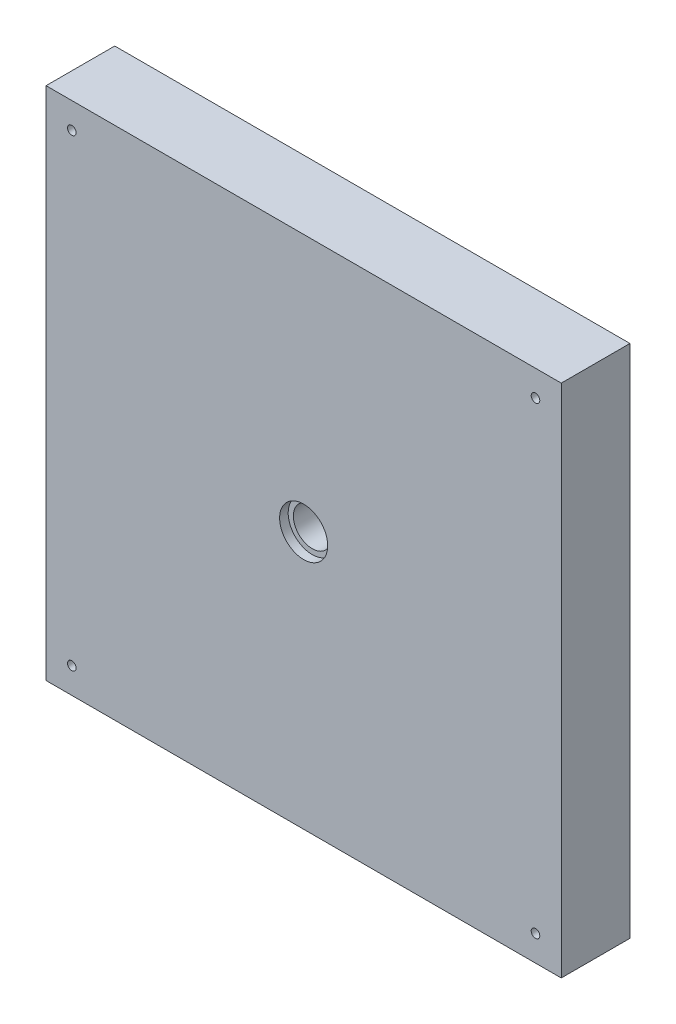
ISO-10303-21;
HEADER;
FILE_DESCRIPTION(('STEP AP214'),'2;1');
FILE_NAME('part.step','',(''),(''),'','','');
FILE_SCHEMA(('AUTOMOTIVE_DESIGN { 1 0 10303 214 1 1 1 1 }'));
ENDSEC;
DATA;
#1=APPLICATION_CONTEXT('core data for automotive mechanical design processes');
#2=APPLICATION_PROTOCOL_DEFINITION('international standard','automotive_design',2000,#1);
#3=PRODUCT_CONTEXT('',#1,'mechanical');
#4=PRODUCT('Part','Part','',(#3));
#5=PRODUCT_RELATED_PRODUCT_CATEGORY('part','',(#4));
#6=PRODUCT_DEFINITION_FORMATION('','',#4);
#7=PRODUCT_DEFINITION_CONTEXT('part definition',#1,'design');
#8=PRODUCT_DEFINITION('design','',#6,#7);
#9=PRODUCT_DEFINITION_SHAPE('','',#8);
#10=(LENGTH_UNIT() NAMED_UNIT(*) SI_UNIT(.MILLI.,.METRE.));
#11=(NAMED_UNIT(*) PLANE_ANGLE_UNIT() SI_UNIT($,.RADIAN.));
#12=(NAMED_UNIT(*) SI_UNIT($,.STERADIAN.) SOLID_ANGLE_UNIT());
#13=UNCERTAINTY_MEASURE_WITH_UNIT(LENGTH_MEASURE(1.E-05),#10,'distance_accuracy_value','');
#14=(GEOMETRIC_REPRESENTATION_CONTEXT(3) GLOBAL_UNCERTAINTY_ASSIGNED_CONTEXT((#13)) GLOBAL_UNIT_ASSIGNED_CONTEXT((#10,
#11,#12)) REPRESENTATION_CONTEXT('',''));
#15=CARTESIAN_POINT('',(0.,0.,0.));
#16=DIRECTION('',(0.,0.,1.));
#17=DIRECTION('',(1.,0.,0.));
#18=AXIS2_PLACEMENT_3D('',#15,#16,#17);
#19=CARTESIAN_POINT('',(150.,-150.,0.));
#20=DIRECTION('',(0.,0.,1.));
#21=DIRECTION('',(1.,0.,0.));
#22=AXIS2_PLACEMENT_3D('',#19,#20,#21);
#23=CYLINDRICAL_SURFACE('',#22,11.);
#24=CARTESIAN_POINT('',(150.,-150.,0.));
#25=DIRECTION('',(0.,0.,1.));
#26=DIRECTION('',(1.,0.,0.));
#27=AXIS2_PLACEMENT_3D('',#24,#25,#26);
#28=CIRCLE('',#27,11.);
#29=CARTESIAN_POINT('',(161.,-150.,0.));
#30=VERTEX_POINT('',#29);
#31=EDGE_CURVE('E140',#30,#30,#28,.T.);
#32=ORIENTED_EDGE('',*,*,#31,.F.);
#33=EDGE_LOOP('',(#32));
#34=FACE_BOUND('',#33,.T.);
#35=CARTESIAN_POINT('',(150.,-150.,35.));
#36=DIRECTION('',(0.,0.,1.));
#37=DIRECTION('',(1.,0.,0.));
#38=AXIS2_PLACEMENT_3D('',#35,#36,#37);
#39=CIRCLE('',#38,11.);
#40=CARTESIAN_POINT('',(161.,-150.,35.));
#41=VERTEX_POINT('',#40);
#42=EDGE_CURVE('E119',#41,#41,#39,.F.);
#43=ORIENTED_EDGE('',*,*,#42,.F.);
#44=EDGE_LOOP('',(#43));
#45=FACE_BOUND('',#44,.T.);
#46=ADVANCED_FACE('F44',(#34,#45),#23,.F.);
#47=CARTESIAN_POINT('',(0.,0.,40.));
#48=DIRECTION('',(1.,0.,0.));
#49=DIRECTION('',(0.,1.,0.));
#50=AXIS2_PLACEMENT_3D('',#47,#48,#49);
#51=PLANE('',#50);
#52=DIRECTION('',(0.,-1.,0.));
#53=VECTOR('',#52,1.);
#54=CARTESIAN_POINT('',(0.,0.,0.));
#55=LINE('',#54,#53);
#56=CARTESIAN_POINT('',(0.,0.,0.));
#57=VERTEX_POINT('',#56);
#58=CARTESIAN_POINT('',(0.,-300.,0.));
#59=VERTEX_POINT('',#58);
#60=EDGE_CURVE('E144',#57,#59,#55,.T.);
#61=ORIENTED_EDGE('',*,*,#60,.T.);
#62=DIRECTION('',(0.,0.,-1.));
#63=VECTOR('',#62,1.);
#64=CARTESIAN_POINT('',(0.,-300.,40.));
#65=LINE('',#64,#63);
#66=CARTESIAN_POINT('',(0.,-300.,40.));
#67=VERTEX_POINT('',#66);
#68=EDGE_CURVE('E174',#67,#59,#65,.T.);
#69=ORIENTED_EDGE('',*,*,#68,.F.);
#70=DIRECTION('',(0.,-1.,0.));
#71=VECTOR('',#70,1.);
#72=CARTESIAN_POINT('',(0.,0.,40.));
#73=LINE('',#72,#71);
#74=CARTESIAN_POINT('',(0.,0.,40.));
#75=VERTEX_POINT('',#74);
#76=EDGE_CURVE('E145',#75,#67,#73,.T.);
#77=ORIENTED_EDGE('',*,*,#76,.F.);
#78=DIRECTION('',(0.,0.,-1.));
#79=VECTOR('',#78,1.);
#80=CARTESIAN_POINT('',(0.,0.,40.));
#81=LINE('',#80,#79);
#82=EDGE_CURVE('E155',#75,#57,#81,.T.);
#83=ORIENTED_EDGE('',*,*,#82,.T.);
#84=EDGE_LOOP('',(#61,#69,#77,#83));
#85=FACE_BOUND('',#84,.T.);
#86=ADVANCED_FACE('F221',(#85),#51,.F.);
#87=CARTESIAN_POINT('',(0.,-300.,40.));
#88=DIRECTION('',(0.,1.,0.));
#89=DIRECTION('',(0.,0.,1.));
#90=AXIS2_PLACEMENT_3D('',#87,#88,#89);
#91=PLANE('',#90);
#92=DIRECTION('',(1.,0.,0.));
#93=VECTOR('',#92,1.);
#94=CARTESIAN_POINT('',(0.,-300.,0.));
#95=LINE('',#94,#93);
#96=CARTESIAN_POINT('',(300.,-300.,0.));
#97=VERTEX_POINT('',#96);
#98=EDGE_CURVE('E159',#59,#97,#95,.T.);
#99=ORIENTED_EDGE('',*,*,#98,.T.);
#100=DIRECTION('',(0.,0.,-1.));
#101=VECTOR('',#100,1.);
#102=CARTESIAN_POINT('',(300.,-300.,40.));
#103=LINE('',#102,#101);
#104=CARTESIAN_POINT('',(300.,-300.,40.));
#105=VERTEX_POINT('',#104);
#106=EDGE_CURVE('E171',#105,#97,#103,.T.);
#107=ORIENTED_EDGE('',*,*,#106,.F.);
#108=DIRECTION('',(1.,0.,0.));
#109=VECTOR('',#108,1.);
#110=CARTESIAN_POINT('',(0.,-300.,40.));
#111=LINE('',#110,#109);
#112=EDGE_CURVE('E94',#67,#105,#111,.T.);
#113=ORIENTED_EDGE('',*,*,#112,.F.);
#114=ORIENTED_EDGE('',*,*,#68,.T.);
#115=EDGE_LOOP('',(#99,#107,#113,#114));
#116=FACE_BOUND('',#115,.T.);
#117=ADVANCED_FACE('F227',(#116),#91,.F.);
#118=CARTESIAN_POINT('',(300.,0.,40.));
#119=DIRECTION('',(-1.,0.,0.));
#120=DIRECTION('',(0.,-1.,0.));
#121=AXIS2_PLACEMENT_3D('',#118,#119,#120);
#122=PLANE('',#121);
#123=DIRECTION('',(0.,1.,0.));
#124=VECTOR('',#123,1.);
#125=CARTESIAN_POINT('',(300.,0.,0.));
#126=LINE('',#125,#124);
#127=CARTESIAN_POINT('',(300.,0.,0.));
#128=VERTEX_POINT('',#127);
#129=EDGE_CURVE('E80',#97,#128,#126,.T.);
#130=ORIENTED_EDGE('',*,*,#129,.T.);
#131=DIRECTION('',(0.,0.,-1.));
#132=VECTOR('',#131,1.);
#133=CARTESIAN_POINT('',(300.,0.,40.));
#134=LINE('',#133,#132);
#135=CARTESIAN_POINT('',(300.,0.,40.));
#136=VERTEX_POINT('',#135);
#137=EDGE_CURVE('E168',#136,#128,#134,.T.);
#138=ORIENTED_EDGE('',*,*,#137,.F.);
#139=DIRECTION('',(0.,1.,0.));
#140=VECTOR('',#139,1.);
#141=CARTESIAN_POINT('',(300.,0.,40.));
#142=LINE('',#141,#140);
#143=EDGE_CURVE('E150',#105,#136,#142,.T.);
#144=ORIENTED_EDGE('',*,*,#143,.F.);
#145=ORIENTED_EDGE('',*,*,#106,.T.);
#146=EDGE_LOOP('',(#130,#138,#144,#145));
#147=FACE_BOUND('',#146,.T.);
#148=ADVANCED_FACE('F247',(#147),#122,.F.);
#149=CARTESIAN_POINT('',(0.,0.,40.));
#150=DIRECTION('',(0.,-1.,0.));
#151=DIRECTION('',(0.,0.,-1.));
#152=AXIS2_PLACEMENT_3D('',#149,#150,#151);
#153=PLANE('',#152);
#154=DIRECTION('',(-1.,0.,0.));
#155=VECTOR('',#154,1.);
#156=CARTESIAN_POINT('',(0.,0.,0.));
#157=LINE('',#156,#155);
#158=EDGE_CURVE('E86',#128,#57,#157,.T.);
#159=ORIENTED_EDGE('',*,*,#158,.T.);
#160=ORIENTED_EDGE('',*,*,#82,.F.);
#161=DIRECTION('',(-1.,0.,0.));
#162=VECTOR('',#161,1.);
#163=CARTESIAN_POINT('',(0.,0.,40.));
#164=LINE('',#163,#162);
#165=EDGE_CURVE('E62',#136,#75,#164,.T.);
#166=ORIENTED_EDGE('',*,*,#165,.F.);
#167=ORIENTED_EDGE('',*,*,#137,.T.);
#168=EDGE_LOOP('',(#159,#160,#166,#167));
#169=FACE_BOUND('',#168,.T.);
#170=ADVANCED_FACE('F240',(#169),#153,.F.);
#171=CARTESIAN_POINT('',(0.,0.,40.));
#172=DIRECTION('',(0.,0.,1.));
#173=DIRECTION('',(1.,0.,0.));
#174=AXIS2_PLACEMENT_3D('',#171,#172,#173);
#175=PLANE('',#174);
#176=CARTESIAN_POINT('',(285.,-15.,40.));
#177=DIRECTION('',(0.,0.,-1.));
#178=DIRECTION('',(-1.,0.,0.));
#179=AXIS2_PLACEMENT_3D('',#176,#177,#178);
#180=CIRCLE('',#179,2.5);
#181=CARTESIAN_POINT('',(282.5,-15.,40.));
#182=VERTEX_POINT('',#181);
#183=EDGE_CURVE('E312',#182,#182,#180,.T.);
#184=ORIENTED_EDGE('',*,*,#183,.T.);
#185=EDGE_LOOP('',(#184));
#186=FACE_BOUND('',#185,.T.);
#187=CARTESIAN_POINT('',(15.,-15.,40.));
#188=DIRECTION('',(0.,0.,-1.));
#189=DIRECTION('',(-1.,0.,0.));
#190=AXIS2_PLACEMENT_3D('',#187,#188,#189);
#191=CIRCLE('',#190,2.5);
#192=CARTESIAN_POINT('',(12.5,-15.,40.));
#193=VERTEX_POINT('',#192);
#194=EDGE_CURVE('E325',#193,#193,#191,.T.);
#195=ORIENTED_EDGE('',*,*,#194,.T.);
#196=EDGE_LOOP('',(#195));
#197=FACE_BOUND('',#196,.T.);
#198=CARTESIAN_POINT('',(15.,-285.,40.));
#199=DIRECTION('',(0.,0.,-1.));
#200=DIRECTION('',(-1.,0.,0.));
#201=AXIS2_PLACEMENT_3D('',#198,#199,#200);
#202=CIRCLE('',#201,2.5);
#203=CARTESIAN_POINT('',(12.5,-285.,40.));
#204=VERTEX_POINT('',#203);
#205=EDGE_CURVE('E333',#204,#204,#202,.T.);
#206=ORIENTED_EDGE('',*,*,#205,.T.);
#207=EDGE_LOOP('',(#206));
#208=FACE_BOUND('',#207,.T.);
#209=CARTESIAN_POINT('',(285.,-285.,40.));
#210=DIRECTION('',(0.,0.,-1.));
#211=DIRECTION('',(-1.,0.,0.));
#212=AXIS2_PLACEMENT_3D('',#209,#210,#211);
#213=CIRCLE('',#212,2.5);
#214=CARTESIAN_POINT('',(282.5,-285.,40.));
#215=VERTEX_POINT('',#214);
#216=EDGE_CURVE('E341',#215,#215,#213,.T.);
#217=ORIENTED_EDGE('',*,*,#216,.T.);
#218=EDGE_LOOP('',(#217));
#219=FACE_BOUND('',#218,.T.);
#220=CARTESIAN_POINT('',(150.,-150.,40.));
#221=DIRECTION('',(0.,0.,1.));
#222=DIRECTION('',(1.,0.,0.));
#223=AXIS2_PLACEMENT_3D('',#220,#221,#222);
#224=CIRCLE('',#223,14.);
#225=CARTESIAN_POINT('',(164.,-150.,40.));
#226=VERTEX_POINT('',#225);
#227=EDGE_CURVE('E130',#226,#226,#224,.T.);
#228=ORIENTED_EDGE('',*,*,#227,.F.);
#229=EDGE_LOOP('',(#228));
#230=FACE_BOUND('',#229,.T.);
#231=ORIENTED_EDGE('',*,*,#76,.T.);
#232=ORIENTED_EDGE('',*,*,#112,.T.);
#233=ORIENTED_EDGE('',*,*,#143,.T.);
#234=ORIENTED_EDGE('',*,*,#165,.T.);
#235=EDGE_LOOP('',(#231,#232,#233,#234));
#236=FACE_BOUND('',#235,.T.);
#237=ADVANCED_FACE('F236',(#186,#197,#208,#219,#230,#236),#175,.T.);
#238=CARTESIAN_POINT('',(0.,0.,0.));
#239=DIRECTION('',(0.,0.,1.));
#240=DIRECTION('',(1.,0.,0.));
#241=AXIS2_PLACEMENT_3D('',#238,#239,#240);
#242=PLANE('',#241);
#243=CARTESIAN_POINT('',(285.,-15.,0.));
#244=DIRECTION('',(0.,0.,-1.));
#245=DIRECTION('',(-1.,0.,0.));
#246=AXIS2_PLACEMENT_3D('',#243,#244,#245);
#247=CIRCLE('',#246,2.5);
#248=CARTESIAN_POINT('',(282.5,-15.,0.));
#249=VERTEX_POINT('',#248);
#250=EDGE_CURVE('E315',#249,#249,#247,.T.);
#251=ORIENTED_EDGE('',*,*,#250,.F.);
#252=EDGE_LOOP('',(#251));
#253=FACE_BOUND('',#252,.T.);
#254=CARTESIAN_POINT('',(15.,-15.,0.));
#255=DIRECTION('',(0.,0.,-1.));
#256=DIRECTION('',(-1.,0.,0.));
#257=AXIS2_PLACEMENT_3D('',#254,#255,#256);
#258=CIRCLE('',#257,2.49999999999999);
#259=CARTESIAN_POINT('',(12.5,-15.,0.));
#260=VERTEX_POINT('',#259);
#261=EDGE_CURVE('E319',#260,#260,#258,.T.);
#262=ORIENTED_EDGE('',*,*,#261,.F.);
#263=EDGE_LOOP('',(#262));
#264=FACE_BOUND('',#263,.T.);
#265=CARTESIAN_POINT('',(15.,-285.,0.));
#266=DIRECTION('',(0.,0.,-1.));
#267=DIRECTION('',(-1.,0.,0.));
#268=AXIS2_PLACEMENT_3D('',#265,#266,#267);
#269=CIRCLE('',#268,2.49999999999999);
#270=CARTESIAN_POINT('',(12.5,-285.,0.));
#271=VERTEX_POINT('',#270);
#272=EDGE_CURVE('E329',#271,#271,#269,.T.);
#273=ORIENTED_EDGE('',*,*,#272,.F.);
#274=EDGE_LOOP('',(#273));
#275=FACE_BOUND('',#274,.T.);
#276=CARTESIAN_POINT('',(285.,-285.,0.));
#277=DIRECTION('',(0.,0.,-1.));
#278=DIRECTION('',(-1.,0.,0.));
#279=AXIS2_PLACEMENT_3D('',#276,#277,#278);
#280=CIRCLE('',#279,2.5);
#281=CARTESIAN_POINT('',(282.5,-285.,0.));
#282=VERTEX_POINT('',#281);
#283=EDGE_CURVE('E337',#282,#282,#280,.T.);
#284=ORIENTED_EDGE('',*,*,#283,.F.);
#285=EDGE_LOOP('',(#284));
#286=FACE_BOUND('',#285,.T.);
#287=CARTESIAN_POINT('',(40.,-150.,0.));
#288=DIRECTION('',(0.,0.,1.));
#289=DIRECTION('',(1.,0.,0.));
#290=AXIS2_PLACEMENT_3D('',#287,#288,#289);
#291=CIRCLE('',#290,3.49999999999989);
#292=CARTESIAN_POINT('',(43.4999999999999,-150.,0.));
#293=VERTEX_POINT('',#292);
#294=EDGE_CURVE('E11',#293,#293,#291,.T.);
#295=ORIENTED_EDGE('',*,*,#294,.T.);
#296=EDGE_LOOP('',(#295));
#297=FACE_BOUND('',#296,.T.);
#298=CARTESIAN_POINT('',(150.,-260.,0.));
#299=DIRECTION('',(0.,0.,1.));
#300=DIRECTION('',(1.,0.,0.));
#301=AXIS2_PLACEMENT_3D('',#298,#299,#300);
#302=CIRCLE('',#301,3.49999999999989);
#303=CARTESIAN_POINT('',(153.5,-260.,0.));
#304=VERTEX_POINT('',#303);
#305=EDGE_CURVE('E197',#304,#304,#302,.T.);
#306=ORIENTED_EDGE('',*,*,#305,.T.);
#307=EDGE_LOOP('',(#306));
#308=FACE_BOUND('',#307,.T.);
#309=CARTESIAN_POINT('',(150.,-40.,0.));
#310=DIRECTION('',(0.,0.,1.));
#311=DIRECTION('',(1.,0.,0.));
#312=AXIS2_PLACEMENT_3D('',#309,#310,#311);
#313=CIRCLE('',#312,3.49999999999989);
#314=CARTESIAN_POINT('',(153.5,-40.,0.));
#315=VERTEX_POINT('',#314);
#316=EDGE_CURVE('E189',#315,#315,#313,.T.);
#317=ORIENTED_EDGE('',*,*,#316,.T.);
#318=EDGE_LOOP('',(#317));
#319=FACE_BOUND('',#318,.T.);
#320=CARTESIAN_POINT('',(260.,-150.,0.));
#321=DIRECTION('',(0.,0.,1.));
#322=DIRECTION('',(1.,0.,0.));
#323=AXIS2_PLACEMENT_3D('',#320,#321,#322);
#324=CIRCLE('',#323,3.49999999999989);
#325=CARTESIAN_POINT('',(263.5,-150.,0.));
#326=VERTEX_POINT('',#325);
#327=EDGE_CURVE('E181',#326,#326,#324,.T.);
#328=ORIENTED_EDGE('',*,*,#327,.T.);
#329=EDGE_LOOP('',(#328));
#330=FACE_BOUND('',#329,.T.);
#331=ORIENTED_EDGE('',*,*,#31,.T.);
#332=EDGE_LOOP('',(#331));
#333=FACE_BOUND('',#332,.T.);
#334=ORIENTED_EDGE('',*,*,#60,.F.);
#335=ORIENTED_EDGE('',*,*,#158,.F.);
#336=ORIENTED_EDGE('',*,*,#129,.F.);
#337=ORIENTED_EDGE('',*,*,#98,.F.);
#338=EDGE_LOOP('',(#334,#335,#336,#337));
#339=FACE_BOUND('',#338,.T.);
#340=ADVANCED_FACE('F239',(#253,#264,#275,#286,#297,#308,#319,#330,#333,#339),#242,.F.);
#341=CARTESIAN_POINT('',(260.,-150.,17.));
#342=DIRECTION('',(0.,0.,-1.));
#343=DIRECTION('',(-1.,0.,0.));
#344=AXIS2_PLACEMENT_3D('',#341,#342,#343);
#345=CONICAL_SURFACE('',#344,2.5,1.02974425867666);
#346=CARTESIAN_POINT('',(260.,-150.,18.5021515475689));
#347=VERTEX_POINT('',#346);
#348=VERTEX_LOOP('',#347);
#349=FACE_BOUND('',#348,.T.);
#350=CARTESIAN_POINT('',(260.,-150.,17.));
#351=DIRECTION('',(0.,0.,-1.));
#352=DIRECTION('',(-1.,0.,0.));
#353=AXIS2_PLACEMENT_3D('',#350,#351,#352);
#354=CIRCLE('',#353,2.5);
#355=CARTESIAN_POINT('',(257.5,-150.,17.));
#356=VERTEX_POINT('',#355);
#357=EDGE_CURVE('E136',#356,#356,#354,.T.);
#358=ORIENTED_EDGE('',*,*,#357,.T.);
#359=EDGE_LOOP('',(#358));
#360=FACE_BOUND('',#359,.T.);
#361=ADVANCED_FACE('F234',(#349,#360),#345,.F.);
#362=CARTESIAN_POINT('',(260.,-150.,0.));
#363=DIRECTION('',(0.,0.,-1.));
#364=DIRECTION('',(-1.,0.,0.));
#365=AXIS2_PLACEMENT_3D('',#362,#363,#364);
#366=CYLINDRICAL_SURFACE('',#365,2.5);
#367=CARTESIAN_POINT('',(260.,-150.,0.999999999999899));
#368=DIRECTION('',(0.,0.,1.));
#369=DIRECTION('',(1.,0.,0.));
#370=AXIS2_PLACEMENT_3D('',#367,#368,#369);
#371=CIRCLE('',#370,2.5);
#372=CARTESIAN_POINT('',(262.5,-150.,0.999999999999899));
#373=VERTEX_POINT('',#372);
#374=EDGE_CURVE('E176',#373,#373,#371,.F.);
#375=ORIENTED_EDGE('',*,*,#374,.T.);
#376=EDGE_LOOP('',(#375));
#377=FACE_BOUND('',#376,.T.);
#378=ORIENTED_EDGE('',*,*,#357,.F.);
#379=EDGE_LOOP('',(#378));
#380=FACE_BOUND('',#379,.T.);
#381=ADVANCED_FACE('F274',(#377,#380),#366,.F.);
#382=CARTESIAN_POINT('',(150.,-40.,17.));
#383=DIRECTION('',(0.,0.,-1.));
#384=DIRECTION('',(-1.,0.,0.));
#385=AXIS2_PLACEMENT_3D('',#382,#383,#384);
#386=CONICAL_SURFACE('',#385,2.5,1.02974425867665);
#387=CARTESIAN_POINT('',(150.,-40.,18.5021515475689));
#388=VERTEX_POINT('',#387);
#389=VERTEX_LOOP('',#388);
#390=FACE_BOUND('',#389,.T.);
#391=CARTESIAN_POINT('',(150.,-40.,17.));
#392=DIRECTION('',(0.,0.,-1.));
#393=DIRECTION('',(-1.,0.,0.));
#394=AXIS2_PLACEMENT_3D('',#391,#392,#393);
#395=CIRCLE('',#394,2.5);
#396=CARTESIAN_POINT('',(147.5,-40.,17.));
#397=VERTEX_POINT('',#396);
#398=EDGE_CURVE('E124',#397,#397,#395,.T.);
#399=ORIENTED_EDGE('',*,*,#398,.T.);
#400=EDGE_LOOP('',(#399));
#401=FACE_BOUND('',#400,.T.);
#402=ADVANCED_FACE('F269',(#390,#401),#386,.F.);
#403=CARTESIAN_POINT('',(150.,-40.,0.));
#404=DIRECTION('',(0.,0.,-1.));
#405=DIRECTION('',(-1.,0.,0.));
#406=AXIS2_PLACEMENT_3D('',#403,#404,#405);
#407=CYLINDRICAL_SURFACE('',#406,2.5);
#408=CARTESIAN_POINT('',(150.,-40.,0.999999999999899));
#409=DIRECTION('',(0.,0.,1.));
#410=DIRECTION('',(1.,0.,0.));
#411=AXIS2_PLACEMENT_3D('',#408,#409,#410);
#412=CIRCLE('',#411,2.5);
#413=CARTESIAN_POINT('',(152.5,-40.,0.999999999999899));
#414=VERTEX_POINT('',#413);
#415=EDGE_CURVE('E185',#414,#414,#412,.F.);
#416=ORIENTED_EDGE('',*,*,#415,.T.);
#417=EDGE_LOOP('',(#416));
#418=FACE_BOUND('',#417,.T.);
#419=ORIENTED_EDGE('',*,*,#398,.F.);
#420=EDGE_LOOP('',(#419));
#421=FACE_BOUND('',#420,.T.);
#422=ADVANCED_FACE('F265',(#418,#421),#407,.F.);
#423=CARTESIAN_POINT('',(40.,-150.,17.));
#424=DIRECTION('',(0.,0.,-1.));
#425=DIRECTION('',(-1.,0.,0.));
#426=AXIS2_PLACEMENT_3D('',#423,#424,#425);
#427=CONICAL_SURFACE('',#426,2.5,1.02974425867665);
#428=CARTESIAN_POINT('',(40.,-150.,18.5021515475689));
#429=VERTEX_POINT('',#428);
#430=VERTEX_LOOP('',#429);
#431=FACE_BOUND('',#430,.T.);
#432=CARTESIAN_POINT('',(40.,-150.,17.));
#433=DIRECTION('',(0.,0.,-1.));
#434=DIRECTION('',(-1.,0.,0.));
#435=AXIS2_PLACEMENT_3D('',#432,#433,#434);
#436=CIRCLE('',#435,2.5);
#437=CARTESIAN_POINT('',(37.5,-150.,17.));
#438=VERTEX_POINT('',#437);
#439=EDGE_CURVE('E118',#438,#438,#436,.T.);
#440=ORIENTED_EDGE('',*,*,#439,.T.);
#441=EDGE_LOOP('',(#440));
#442=FACE_BOUND('',#441,.T.);
#443=ADVANCED_FACE('F268',(#431,#442),#427,.F.);
#444=CARTESIAN_POINT('',(40.,-150.,0.));
#445=DIRECTION('',(0.,0.,-1.));
#446=DIRECTION('',(-1.,0.,0.));
#447=AXIS2_PLACEMENT_3D('',#444,#445,#446);
#448=CYLINDRICAL_SURFACE('',#447,2.5);
#449=CARTESIAN_POINT('',(40.,-150.,0.999999999999902));
#450=DIRECTION('',(0.,0.,1.));
#451=DIRECTION('',(1.,0.,0.));
#452=AXIS2_PLACEMENT_3D('',#449,#450,#451);
#453=CIRCLE('',#452,2.5);
#454=CARTESIAN_POINT('',(42.5,-150.,0.999999999999902));
#455=VERTEX_POINT('',#454);
#456=EDGE_CURVE('E54',#455,#455,#453,.F.);
#457=ORIENTED_EDGE('',*,*,#456,.T.);
#458=EDGE_LOOP('',(#457));
#459=FACE_BOUND('',#458,.T.);
#460=ORIENTED_EDGE('',*,*,#439,.F.);
#461=EDGE_LOOP('',(#460));
#462=FACE_BOUND('',#461,.T.);
#463=ADVANCED_FACE('F111',(#459,#462),#448,.F.);
#464=CARTESIAN_POINT('',(150.,-260.,17.));
#465=DIRECTION('',(0.,0.,-1.));
#466=DIRECTION('',(-1.,0.,0.));
#467=AXIS2_PLACEMENT_3D('',#464,#465,#466);
#468=CONICAL_SURFACE('',#467,2.5,1.02974425867666);
#469=CARTESIAN_POINT('',(150.,-260.,18.5021515475689));
#470=VERTEX_POINT('',#469);
#471=VERTEX_LOOP('',#470);
#472=FACE_BOUND('',#471,.T.);
#473=CARTESIAN_POINT('',(150.,-260.,17.));
#474=DIRECTION('',(0.,0.,-1.));
#475=DIRECTION('',(-1.,0.,0.));
#476=AXIS2_PLACEMENT_3D('',#473,#474,#475);
#477=CIRCLE('',#476,2.5);
#478=CARTESIAN_POINT('',(147.5,-260.,17.));
#479=VERTEX_POINT('',#478);
#480=EDGE_CURVE('E115',#479,#479,#477,.T.);
#481=ORIENTED_EDGE('',*,*,#480,.T.);
#482=EDGE_LOOP('',(#481));
#483=FACE_BOUND('',#482,.T.);
#484=ADVANCED_FACE('F107',(#472,#483),#468,.F.);
#485=CARTESIAN_POINT('',(150.,-260.,0.));
#486=DIRECTION('',(0.,0.,-1.));
#487=DIRECTION('',(-1.,0.,0.));
#488=AXIS2_PLACEMENT_3D('',#485,#486,#487);
#489=CYLINDRICAL_SURFACE('',#488,2.5);
#490=CARTESIAN_POINT('',(150.,-260.,0.999999999999899));
#491=DIRECTION('',(0.,0.,1.));
#492=DIRECTION('',(1.,0.,0.));
#493=AXIS2_PLACEMENT_3D('',#490,#491,#492);
#494=CIRCLE('',#493,2.5);
#495=CARTESIAN_POINT('',(152.5,-260.,0.999999999999899));
#496=VERTEX_POINT('',#495);
#497=EDGE_CURVE('E193',#496,#496,#494,.F.);
#498=ORIENTED_EDGE('',*,*,#497,.T.);
#499=EDGE_LOOP('',(#498));
#500=FACE_BOUND('',#499,.T.);
#501=ORIENTED_EDGE('',*,*,#480,.F.);
#502=EDGE_LOOP('',(#501));
#503=FACE_BOUND('',#502,.T.);
#504=ADVANCED_FACE('F110',(#500,#503),#489,.F.);
#505=CARTESIAN_POINT('',(150.,-150.,35.));
#506=DIRECTION('',(0.,0.,1.));
#507=DIRECTION('',(1.,0.,0.));
#508=AXIS2_PLACEMENT_3D('',#505,#506,#507);
#509=PLANE('',#508);
#510=CARTESIAN_POINT('',(150.,-150.,35.));
#511=DIRECTION('',(0.,0.,1.));
#512=DIRECTION('',(1.,0.,0.));
#513=AXIS2_PLACEMENT_3D('',#510,#511,#512);
#514=CIRCLE('',#513,14.);
#515=CARTESIAN_POINT('',(164.,-150.,35.));
#516=VERTEX_POINT('',#515);
#517=EDGE_CURVE('E127',#516,#516,#514,.T.);
#518=ORIENTED_EDGE('',*,*,#517,.T.);
#519=EDGE_LOOP('',(#518));
#520=FACE_BOUND('',#519,.T.);
#521=ORIENTED_EDGE('',*,*,#42,.T.);
#522=EDGE_LOOP('',(#521));
#523=FACE_BOUND('',#522,.T.);
#524=ADVANCED_FACE('F289',(#520,#523),#509,.T.);
#525=CARTESIAN_POINT('',(150.,-150.,35.));
#526=DIRECTION('',(0.,0.,1.));
#527=DIRECTION('',(1.,0.,0.));
#528=AXIS2_PLACEMENT_3D('',#525,#526,#527);
#529=CYLINDRICAL_SURFACE('',#528,14.);
#530=ORIENTED_EDGE('',*,*,#517,.F.);
#531=EDGE_LOOP('',(#530));
#532=FACE_BOUND('',#531,.T.);
#533=ORIENTED_EDGE('',*,*,#227,.T.);
#534=EDGE_LOOP('',(#533));
#535=FACE_BOUND('',#534,.T.);
#536=ADVANCED_FACE('F255',(#532,#535),#529,.F.);
#537=CARTESIAN_POINT('',(260.,-150.,0.999999999999899));
#538=DIRECTION('',(0.,0.,-1.));
#539=DIRECTION('',(-1.,0.,0.));
#540=AXIS2_PLACEMENT_3D('',#537,#538,#539);
#541=CONICAL_SURFACE('',#540,2.5,0.785398163397444);
#542=ORIENTED_EDGE('',*,*,#327,.F.);
#543=EDGE_LOOP('',(#542));
#544=FACE_BOUND('',#543,.T.);
#545=ORIENTED_EDGE('',*,*,#374,.F.);
#546=EDGE_LOOP('',(#545));
#547=FACE_BOUND('',#546,.T.);
#548=ADVANCED_FACE('F252',(#544,#547),#541,.F.);
#549=CARTESIAN_POINT('',(150.,-40.,0.999999999999899));
#550=DIRECTION('',(0.,0.,-1.));
#551=DIRECTION('',(-1.,0.,0.));
#552=AXIS2_PLACEMENT_3D('',#549,#550,#551);
#553=CONICAL_SURFACE('',#552,2.5,0.785398163397444);
#554=ORIENTED_EDGE('',*,*,#316,.F.);
#555=EDGE_LOOP('',(#554));
#556=FACE_BOUND('',#555,.T.);
#557=ORIENTED_EDGE('',*,*,#415,.F.);
#558=EDGE_LOOP('',(#557));
#559=FACE_BOUND('',#558,.T.);
#560=ADVANCED_FACE('F217',(#556,#559),#553,.F.);
#561=CARTESIAN_POINT('',(150.,-260.,0.999999999999899));
#562=DIRECTION('',(0.,0.,-1.));
#563=DIRECTION('',(-1.,0.,0.));
#564=AXIS2_PLACEMENT_3D('',#561,#562,#563);
#565=CONICAL_SURFACE('',#564,2.5,0.785398163397444);
#566=ORIENTED_EDGE('',*,*,#305,.F.);
#567=EDGE_LOOP('',(#566));
#568=FACE_BOUND('',#567,.T.);
#569=ORIENTED_EDGE('',*,*,#497,.F.);
#570=EDGE_LOOP('',(#569));
#571=FACE_BOUND('',#570,.T.);
#572=ADVANCED_FACE('F208',(#568,#571),#565,.F.);
#573=CARTESIAN_POINT('',(40.,-150.,0.999999999999902));
#574=DIRECTION('',(0.,0.,-1.));
#575=DIRECTION('',(-1.,0.,0.));
#576=AXIS2_PLACEMENT_3D('',#573,#574,#575);
#577=CONICAL_SURFACE('',#576,2.5,0.785398163397444);
#578=ORIENTED_EDGE('',*,*,#294,.F.);
#579=EDGE_LOOP('',(#578));
#580=FACE_BOUND('',#579,.T.);
#581=ORIENTED_EDGE('',*,*,#456,.F.);
#582=EDGE_LOOP('',(#581));
#583=FACE_BOUND('',#582,.T.);
#584=ADVANCED_FACE('F46',(#580,#583),#577,.F.);
#585=CARTESIAN_POINT('',(285.,-285.,0.));
#586=DIRECTION('',(0.,0.,-1.));
#587=DIRECTION('',(-1.,0.,0.));
#588=AXIS2_PLACEMENT_3D('',#585,#586,#587);
#589=CYLINDRICAL_SURFACE('',#588,2.5);
#590=ORIENTED_EDGE('',*,*,#216,.F.);
#591=EDGE_LOOP('',(#590));
#592=FACE_BOUND('',#591,.T.);
#593=ORIENTED_EDGE('',*,*,#283,.T.);
#594=EDGE_LOOP('',(#593));
#595=FACE_BOUND('',#594,.T.);
#596=ADVANCED_FACE('F207',(#592,#595),#589,.F.);
#597=CARTESIAN_POINT('',(15.,-285.,0.));
#598=DIRECTION('',(0.,0.,-1.));
#599=DIRECTION('',(-1.,0.,0.));
#600=AXIS2_PLACEMENT_3D('',#597,#598,#599);
#601=CYLINDRICAL_SURFACE('',#600,2.49999999999999);
#602=ORIENTED_EDGE('',*,*,#205,.F.);
#603=EDGE_LOOP('',(#602));
#604=FACE_BOUND('',#603,.T.);
#605=ORIENTED_EDGE('',*,*,#272,.T.);
#606=EDGE_LOOP('',(#605));
#607=FACE_BOUND('',#606,.T.);
#608=ADVANCED_FACE('F214',(#604,#607),#601,.F.);
#609=CARTESIAN_POINT('',(15.,-15.,0.));
#610=DIRECTION('',(0.,0.,-1.));
#611=DIRECTION('',(-1.,0.,0.));
#612=AXIS2_PLACEMENT_3D('',#609,#610,#611);
#613=CYLINDRICAL_SURFACE('',#612,2.49999999999999);
#614=ORIENTED_EDGE('',*,*,#194,.F.);
#615=EDGE_LOOP('',(#614));
#616=FACE_BOUND('',#615,.T.);
#617=ORIENTED_EDGE('',*,*,#261,.T.);
#618=EDGE_LOOP('',(#617));
#619=FACE_BOUND('',#618,.T.);
#620=ADVANCED_FACE('F299',(#616,#619),#613,.F.);
#621=CARTESIAN_POINT('',(285.,-15.,0.));
#622=DIRECTION('',(0.,0.,-1.));
#623=DIRECTION('',(-1.,0.,0.));
#624=AXIS2_PLACEMENT_3D('',#621,#622,#623);
#625=CYLINDRICAL_SURFACE('',#624,2.5);
#626=ORIENTED_EDGE('',*,*,#183,.F.);
#627=EDGE_LOOP('',(#626));
#628=FACE_BOUND('',#627,.T.);
#629=ORIENTED_EDGE('',*,*,#250,.T.);
#630=EDGE_LOOP('',(#629));
#631=FACE_BOUND('',#630,.T.);
#632=ADVANCED_FACE('F303',(#628,#631),#625,.F.);
#633=CLOSED_SHELL('',(#46,#86,#117,#148,#170,#237,#340,#361,#381,#402,#422,#443,#463,#484,#504,
#524,#536,#548,#560,#572,#584,#596,#608,#620,#632));
#634=MANIFOLD_SOLID_BREP('B2',#633);
#635=ADVANCED_BREP_SHAPE_REPRESENTATION('',(#18,#634),#14);
#636=SHAPE_DEFINITION_REPRESENTATION(#9,#635);
ENDSEC;
END-ISO-10303-21;
